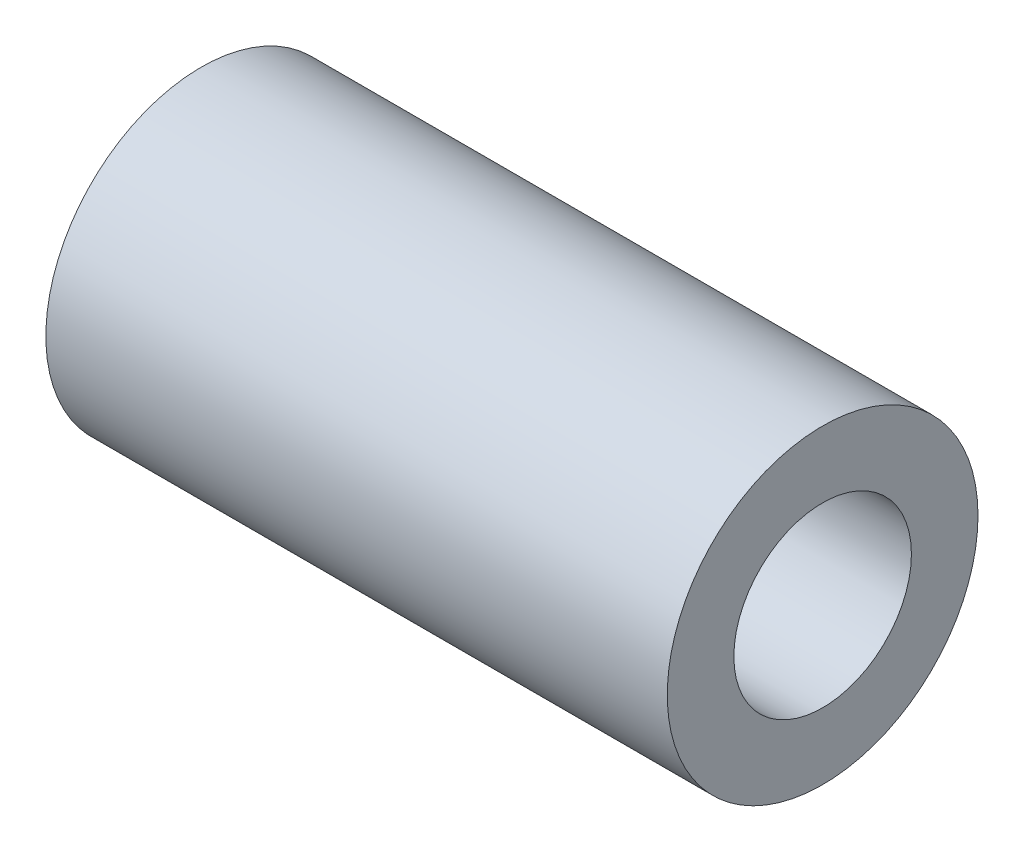
ISO-10303-21;
HEADER;
FILE_DESCRIPTION(('STEP AP214'),'2;1');
FILE_NAME('part.step','',(''),(''),'','','');
FILE_SCHEMA(('AUTOMOTIVE_DESIGN { 1 0 10303 214 1 1 1 1 }'));
ENDSEC;
DATA;
#1=APPLICATION_CONTEXT('core data for automotive mechanical design processes');
#2=APPLICATION_PROTOCOL_DEFINITION('international standard','automotive_design',2000,#1);
#3=PRODUCT_CONTEXT('',#1,'mechanical');
#4=PRODUCT('Part','Part','',(#3));
#5=PRODUCT_RELATED_PRODUCT_CATEGORY('part','',(#4));
#6=PRODUCT_DEFINITION_FORMATION('','',#4);
#7=PRODUCT_DEFINITION_CONTEXT('part definition',#1,'design');
#8=PRODUCT_DEFINITION('design','',#6,#7);
#9=PRODUCT_DEFINITION_SHAPE('','',#8);
#10=(LENGTH_UNIT() NAMED_UNIT(*) SI_UNIT(.MILLI.,.METRE.));
#11=(NAMED_UNIT(*) PLANE_ANGLE_UNIT() SI_UNIT($,.RADIAN.));
#12=(NAMED_UNIT(*) SI_UNIT($,.STERADIAN.) SOLID_ANGLE_UNIT());
#13=UNCERTAINTY_MEASURE_WITH_UNIT(LENGTH_MEASURE(1.E-05),#10,'distance_accuracy_value','');
#14=(GEOMETRIC_REPRESENTATION_CONTEXT(3) GLOBAL_UNCERTAINTY_ASSIGNED_CONTEXT((#13)) GLOBAL_UNIT_ASSIGNED_CONTEXT((#10,
#11,#12)) REPRESENTATION_CONTEXT('',''));
#15=CARTESIAN_POINT('',(0.,0.,0.));
#16=DIRECTION('',(0.,0.,1.));
#17=DIRECTION('',(1.,0.,0.));
#18=AXIS2_PLACEMENT_3D('',#15,#16,#17);
#19=CARTESIAN_POINT('',(14.,0.,0.));
#20=DIRECTION('',(1.,0.,0.));
#21=DIRECTION('',(0.,0.,-1.));
#22=AXIS2_PLACEMENT_3D('',#19,#20,#21);
#23=PLANE('',#22);
#24=CARTESIAN_POINT('',(14.,0.,0.));
#25=DIRECTION('',(1.,0.,0.));
#26=DIRECTION('',(0.,0.,-1.));
#27=AXIS2_PLACEMENT_3D('',#24,#25,#26);
#28=CIRCLE('',#27,7.);
#29=CARTESIAN_POINT('',(14.,0.,-7.));
#30=VERTEX_POINT('',#29);
#31=EDGE_CURVE('E10',#30,#30,#28,.T.);
#32=ORIENTED_EDGE('',*,*,#31,.T.);
#33=EDGE_LOOP('',(#32));
#34=FACE_BOUND('',#33,.T.);
#35=CARTESIAN_POINT('',(14.,0.,0.));
#36=DIRECTION('',(1.,0.,0.));
#37=DIRECTION('',(0.,0.,-1.));
#38=AXIS2_PLACEMENT_3D('',#35,#36,#37);
#39=CIRCLE('',#38,4.);
#40=CARTESIAN_POINT('',(14.,0.,-4.));
#41=VERTEX_POINT('',#40);
#42=EDGE_CURVE('E46',#41,#41,#39,.T.);
#43=ORIENTED_EDGE('',*,*,#42,.F.);
#44=EDGE_LOOP('',(#43));
#45=FACE_BOUND('',#44,.T.);
#46=ADVANCED_FACE('F34',(#34,#45),#23,.T.);
#47=CARTESIAN_POINT('',(-14.,0.,0.));
#48=DIRECTION('',(1.,0.,0.));
#49=DIRECTION('',(0.,0.,-1.));
#50=AXIS2_PLACEMENT_3D('',#47,#48,#49);
#51=PLANE('',#50);
#52=CARTESIAN_POINT('',(-14.,0.,0.));
#53=DIRECTION('',(1.,0.,0.));
#54=DIRECTION('',(0.,0.,-1.));
#55=AXIS2_PLACEMENT_3D('',#52,#53,#54);
#56=CIRCLE('',#55,7.);
#57=CARTESIAN_POINT('',(-14.,0.,-7.));
#58=VERTEX_POINT('',#57);
#59=EDGE_CURVE('E39',#58,#58,#56,.T.);
#60=ORIENTED_EDGE('',*,*,#59,.F.);
#61=EDGE_LOOP('',(#60));
#62=FACE_BOUND('',#61,.T.);
#63=CARTESIAN_POINT('',(-14.,0.,0.));
#64=DIRECTION('',(1.,0.,0.));
#65=DIRECTION('',(0.,0.,-1.));
#66=AXIS2_PLACEMENT_3D('',#63,#64,#65);
#67=CIRCLE('',#66,4.);
#68=CARTESIAN_POINT('',(-14.,0.,-4.));
#69=VERTEX_POINT('',#68);
#70=EDGE_CURVE('E48',#69,#69,#67,.T.);
#71=ORIENTED_EDGE('',*,*,#70,.T.);
#72=EDGE_LOOP('',(#71));
#73=FACE_BOUND('',#72,.T.);
#74=ADVANCED_FACE('F59',(#62,#73),#51,.F.);
#75=CARTESIAN_POINT('',(14.,0.,0.));
#76=DIRECTION('',(-1.,0.,0.));
#77=DIRECTION('',(0.,0.,1.));
#78=AXIS2_PLACEMENT_3D('',#75,#76,#77);
#79=CYLINDRICAL_SURFACE('',#78,7.);
#80=ORIENTED_EDGE('',*,*,#31,.F.);
#81=EDGE_LOOP('',(#80));
#82=FACE_BOUND('',#81,.T.);
#83=ORIENTED_EDGE('',*,*,#59,.T.);
#84=EDGE_LOOP('',(#83));
#85=FACE_BOUND('',#84,.T.);
#86=ADVANCED_FACE('F40',(#82,#85),#79,.T.);
#87=CARTESIAN_POINT('',(14.,0.,0.));
#88=DIRECTION('',(-1.,0.,0.));
#89=DIRECTION('',(0.,0.,1.));
#90=AXIS2_PLACEMENT_3D('',#87,#88,#89);
#91=CYLINDRICAL_SURFACE('',#90,4.);
#92=ORIENTED_EDGE('',*,*,#42,.T.);
#93=EDGE_LOOP('',(#92));
#94=FACE_BOUND('',#93,.T.);
#95=ORIENTED_EDGE('',*,*,#70,.F.);
#96=EDGE_LOOP('',(#95));
#97=FACE_BOUND('',#96,.T.);
#98=ADVANCED_FACE('F53',(#94,#97),#91,.F.);
#99=CLOSED_SHELL('',(#46,#74,#86,#98));
#100=MANIFOLD_SOLID_BREP('B2',#99);
#101=ADVANCED_BREP_SHAPE_REPRESENTATION('',(#18,#100),#14);
#102=SHAPE_DEFINITION_REPRESENTATION(#9,#101);
ENDSEC;
END-ISO-10303-21;
